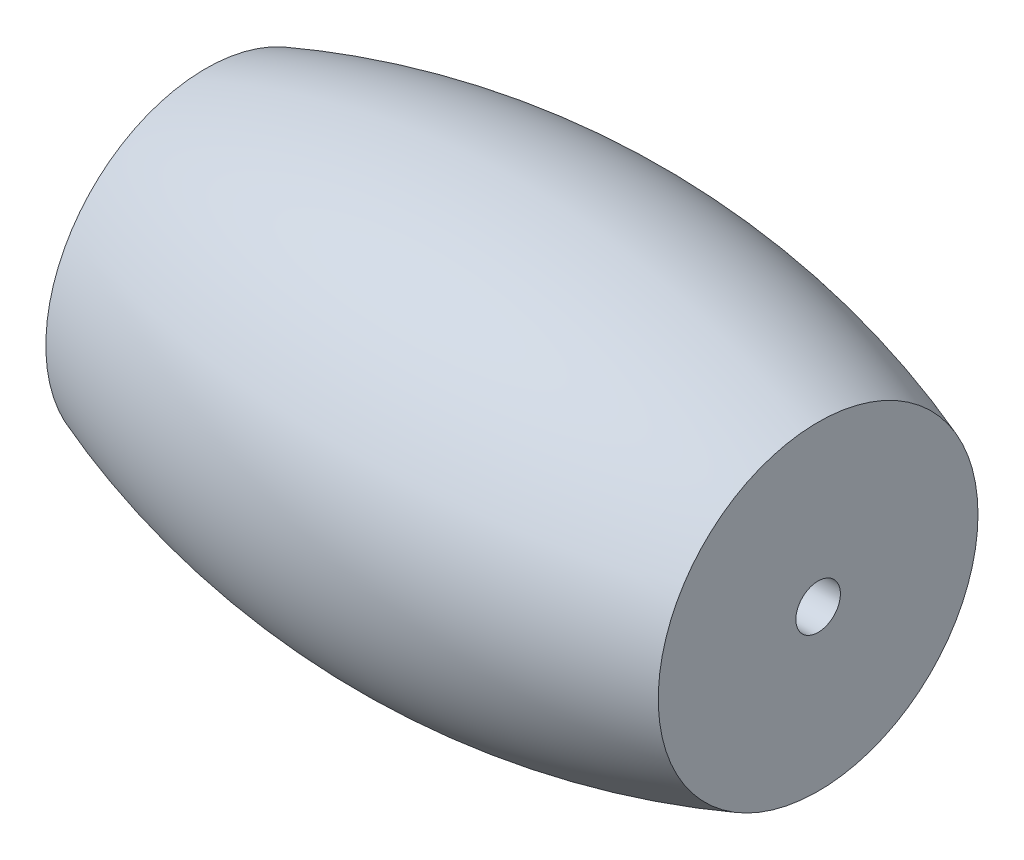
ISO-10303-21;
HEADER;
FILE_DESCRIPTION(('STEP AP214'),'2;1');
FILE_NAME('part.step','',(''),(''),'','','');
FILE_SCHEMA(('AUTOMOTIVE_DESIGN { 1 0 10303 214 1 1 1 1 }'));
ENDSEC;
DATA;
#1=APPLICATION_CONTEXT('core data for automotive mechanical design processes');
#2=APPLICATION_PROTOCOL_DEFINITION('international standard','automotive_design',2000,#1);
#3=PRODUCT_CONTEXT('',#1,'mechanical');
#4=PRODUCT('Part','Part','',(#3));
#5=PRODUCT_RELATED_PRODUCT_CATEGORY('part','',(#4));
#6=PRODUCT_DEFINITION_FORMATION('','',#4);
#7=PRODUCT_DEFINITION_CONTEXT('part definition',#1,'design');
#8=PRODUCT_DEFINITION('design','',#6,#7);
#9=PRODUCT_DEFINITION_SHAPE('','',#8);
#10=(LENGTH_UNIT() NAMED_UNIT(*) SI_UNIT(.MILLI.,.METRE.));
#11=(NAMED_UNIT(*) PLANE_ANGLE_UNIT() SI_UNIT($,.RADIAN.));
#12=(NAMED_UNIT(*) SI_UNIT($,.STERADIAN.) SOLID_ANGLE_UNIT());
#13=UNCERTAINTY_MEASURE_WITH_UNIT(LENGTH_MEASURE(1.E-05),#10,'distance_accuracy_value','');
#14=(GEOMETRIC_REPRESENTATION_CONTEXT(3) GLOBAL_UNCERTAINTY_ASSIGNED_CONTEXT((#13)) GLOBAL_UNIT_ASSIGNED_CONTEXT((#10,
#11,#12)) REPRESENTATION_CONTEXT('',''));
#15=CARTESIAN_POINT('',(0.,0.,0.));
#16=DIRECTION('',(0.,0.,1.));
#17=DIRECTION('',(1.,0.,0.));
#18=AXIS2_PLACEMENT_3D('',#15,#16,#17);
#19=CARTESIAN_POINT('',(-21.1805800544158,25.8296398570499,0.));
#20=DIRECTION('',(1.,0.,0.));
#21=DIRECTION('',(0.,1.,0.));
#22=AXIS2_PLACEMENT_3D('',#19,#20,#21);
#23=CYLINDRICAL_SURFACE('',#22,0.85);
#24=CARTESIAN_POINT('',(11.6832400732423,25.8296398570499,0.));
#25=DIRECTION('',(1.,0.,0.));
#26=DIRECTION('',(0.,1.,0.));
#27=AXIS2_PLACEMENT_3D('',#24,#25,#26);
#28=CIRCLE('',#27,0.85);
#29=CARTESIAN_POINT('',(11.6832400732423,26.6796398570499,0.));
#30=VERTEX_POINT('',#29);
#31=EDGE_CURVE('E28',#30,#30,#28,.F.);
#32=ORIENTED_EDGE('',*,*,#31,.F.);
#33=EDGE_LOOP('',(#32));
#34=FACE_BOUND('',#33,.T.);
#35=CARTESIAN_POINT('',(-11.6832400732423,25.8296398570499,0.));
#36=DIRECTION('',(1.,0.,0.));
#37=DIRECTION('',(0.,1.,0.));
#38=AXIS2_PLACEMENT_3D('',#35,#36,#37);
#39=CIRCLE('',#38,0.85);
#40=CARTESIAN_POINT('',(-11.6832400732423,26.6796398570499,0.));
#41=VERTEX_POINT('',#40);
#42=EDGE_CURVE('E19',#41,#41,#39,.T.);
#43=ORIENTED_EDGE('',*,*,#42,.F.);
#44=EDGE_LOOP('',(#43));
#45=FACE_BOUND('',#44,.T.);
#46=ADVANCED_FACE('F15',(#34,#45),#23,.F.);
#47=CARTESIAN_POINT('',(-11.6832400732423,31.9296398570814,0.));
#48=DIRECTION('',(-1.,0.,0.));
#49=DIRECTION('',(0.,-1.,0.));
#50=AXIS2_PLACEMENT_3D('',#47,#48,#49);
#51=PLANE('',#50);
#52=ORIENTED_EDGE('',*,*,#42,.T.);
#53=EDGE_LOOP('',(#52));
#54=FACE_BOUND('',#53,.T.);
#55=CARTESIAN_POINT('',(-11.6832400732423,25.8296398570499,0.));
#56=DIRECTION('',(1.,0.,0.));
#57=DIRECTION('',(0.,0.,-1.));
#58=AXIS2_PLACEMENT_3D('',#55,#56,#57);
#59=CIRCLE('',#58,6.10000000003149);
#60=CARTESIAN_POINT('',(-11.6832400732423,25.8296398570499,-6.10000000003149));
#61=VERTEX_POINT('',#60);
#62=EDGE_CURVE('E23',#61,#61,#59,.F.);
#63=ORIENTED_EDGE('',*,*,#62,.T.);
#64=EDGE_LOOP('',(#63));
#65=FACE_BOUND('',#64,.T.);
#66=ADVANCED_FACE('F36',(#54,#65),#51,.T.);
#67=CARTESIAN_POINT('',(11.6832400732423,25.8296398570499,0.));
#68=DIRECTION('',(1.,0.,0.));
#69=DIRECTION('',(0.,1.,0.));
#70=AXIS2_PLACEMENT_3D('',#67,#68,#69);
#71=PLANE('',#70);
#72=ORIENTED_EDGE('',*,*,#31,.T.);
#73=EDGE_LOOP('',(#72));
#74=FACE_BOUND('',#73,.T.);
#75=CARTESIAN_POINT('',(11.6832400732423,25.8296398570499,0.));
#76=DIRECTION('',(1.,0.,0.));
#77=DIRECTION('',(0.,0.,-1.));
#78=AXIS2_PLACEMENT_3D('',#75,#76,#77);
#79=CIRCLE('',#78,6.10000000003148);
#80=CARTESIAN_POINT('',(11.6832400732423,25.8296398570499,-6.10000000003148));
#81=VERTEX_POINT('',#80);
#82=EDGE_CURVE('E10',#81,#81,#79,.T.);
#83=ORIENTED_EDGE('',*,*,#82,.T.);
#84=EDGE_LOOP('',(#83));
#85=FACE_BOUND('',#84,.T.);
#86=ADVANCED_FACE('F45',(#74,#85),#71,.T.);
#87=CARTESIAN_POINT('',(0.,25.8296398570499,0.));
#88=DIRECTION('',(1.,0.,0.));
#89=DIRECTION('',(0.,0.,-1.));
#90=AXIS2_PLACEMENT_3D('',#87,#88,#89);
#91=DEGENERATE_TOROIDAL_SURFACE('',#90,25.8296398570498,34.0000000001754,.F.);
#92=ORIENTED_EDGE('',*,*,#62,.F.);
#93=EDGE_LOOP('',(#92));
#94=FACE_BOUND('',#93,.T.);
#95=ORIENTED_EDGE('',*,*,#82,.F.);
#96=EDGE_LOOP('',(#95));
#97=FACE_BOUND('',#96,.T.);
#98=ADVANCED_FACE('F17',(#94,#97),#91,.F.);
#99=CLOSED_SHELL('',(#46,#66,#86,#98));
#100=MANIFOLD_SOLID_BREP('B1',#99);
#101=ADVANCED_BREP_SHAPE_REPRESENTATION('',(#18,#100),#14);
#102=SHAPE_DEFINITION_REPRESENTATION(#9,#101);
ENDSEC;
END-ISO-10303-21;
